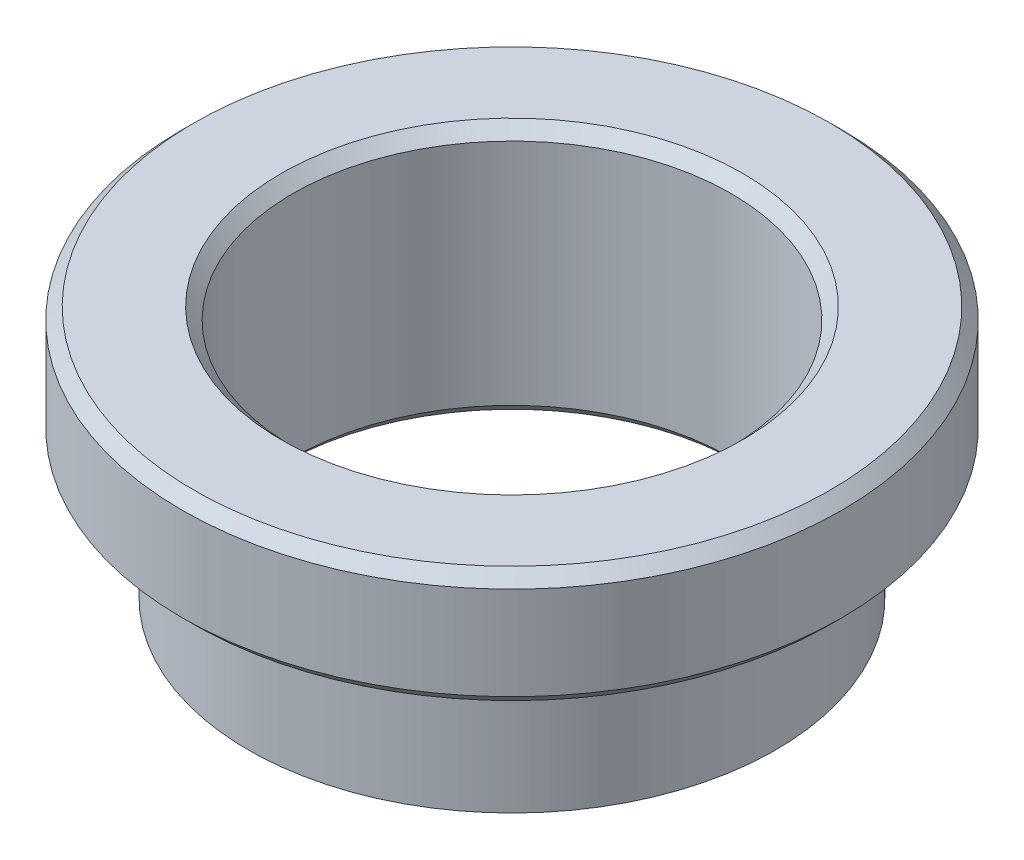
ISO-10303-21;
HEADER;
FILE_DESCRIPTION(('STEP AP214'),'2;1');
FILE_NAME('part.step','',(''),(''),'','','');
FILE_SCHEMA(('AUTOMOTIVE_DESIGN { 1 0 10303 214 1 1 1 1 }'));
ENDSEC;
DATA;
#1=APPLICATION_CONTEXT('core data for automotive mechanical design processes');
#2=APPLICATION_PROTOCOL_DEFINITION('international standard','automotive_design',2000,#1);
#3=PRODUCT_CONTEXT('',#1,'mechanical');
#4=PRODUCT('Part','Part','',(#3));
#5=PRODUCT_RELATED_PRODUCT_CATEGORY('part','',(#4));
#6=PRODUCT_DEFINITION_FORMATION('','',#4);
#7=PRODUCT_DEFINITION_CONTEXT('part definition',#1,'design');
#8=PRODUCT_DEFINITION('design','',#6,#7);
#9=PRODUCT_DEFINITION_SHAPE('','',#8);
#10=(LENGTH_UNIT() NAMED_UNIT(*) SI_UNIT(.MILLI.,.METRE.));
#11=(NAMED_UNIT(*) PLANE_ANGLE_UNIT() SI_UNIT($,.RADIAN.));
#12=(NAMED_UNIT(*) SI_UNIT($,.STERADIAN.) SOLID_ANGLE_UNIT());
#13=UNCERTAINTY_MEASURE_WITH_UNIT(LENGTH_MEASURE(1.E-05),#10,'distance_accuracy_value','');
#14=(GEOMETRIC_REPRESENTATION_CONTEXT(3) GLOBAL_UNCERTAINTY_ASSIGNED_CONTEXT((#13)) GLOBAL_UNIT_ASSIGNED_CONTEXT((#10,
#11,#12)) REPRESENTATION_CONTEXT('',''));
#15=CARTESIAN_POINT('',(0.,0.,0.));
#16=DIRECTION('',(0.,0.,1.));
#17=DIRECTION('',(1.,0.,0.));
#18=AXIS2_PLACEMENT_3D('',#15,#16,#17);
#19=CARTESIAN_POINT('',(0.,0.,0.));
#20=DIRECTION('',(0.,-1.,0.));
#21=DIRECTION('',(0.,0.,-1.));
#22=AXIS2_PLACEMENT_3D('',#19,#20,#21);
#23=CONICAL_SURFACE('',#22,5.95,0.785398163397448);
#24=CARTESIAN_POINT('',(0.,0.3,0.));
#25=DIRECTION('',(0.,-1.,0.));
#26=DIRECTION('',(0.,0.,-1.));
#27=AXIS2_PLACEMENT_3D('',#24,#25,#26);
#28=CIRCLE('',#27,5.65);
#29=CARTESIAN_POINT('',(0.,0.3,-5.65));
#30=VERTEX_POINT('',#29);
#31=EDGE_CURVE('E79',#30,#30,#28,.T.);
#32=ORIENTED_EDGE('',*,*,#31,.F.);
#33=EDGE_LOOP('',(#32));
#34=FACE_BOUND('',#33,.T.);
#35=CARTESIAN_POINT('',(0.,0.,0.));
#36=DIRECTION('',(0.,-1.,0.));
#37=DIRECTION('',(0.,0.,-1.));
#38=AXIS2_PLACEMENT_3D('',#35,#36,#37);
#39=CIRCLE('',#38,5.95);
#40=CARTESIAN_POINT('',(0.,0.,-5.95));
#41=VERTEX_POINT('',#40);
#42=EDGE_CURVE('E10',#41,#41,#39,.T.);
#43=ORIENTED_EDGE('',*,*,#42,.T.);
#44=EDGE_LOOP('',(#43));
#45=FACE_BOUND('',#44,.T.);
#46=ADVANCED_FACE('F45',(#34,#45),#23,.F.);
#47=CARTESIAN_POINT('',(0.,0.,0.));
#48=DIRECTION('',(0.,-1.,0.));
#49=DIRECTION('',(0.,0.,-1.));
#50=AXIS2_PLACEMENT_3D('',#47,#48,#49);
#51=PLANE('',#50);
#52=CARTESIAN_POINT('',(0.,0.,0.));
#53=DIRECTION('',(0.,-1.,0.));
#54=DIRECTION('',(0.,0.,-1.));
#55=AXIS2_PLACEMENT_3D('',#52,#53,#54);
#56=CIRCLE('',#55,6.8);
#57=CARTESIAN_POINT('',(0.,0.,-6.8));
#58=VERTEX_POINT('',#57);
#59=EDGE_CURVE('E51',#58,#58,#56,.T.);
#60=ORIENTED_EDGE('',*,*,#59,.T.);
#61=EDGE_LOOP('',(#60));
#62=FACE_BOUND('',#61,.T.);
#63=ORIENTED_EDGE('',*,*,#42,.F.);
#64=EDGE_LOOP('',(#63));
#65=FACE_BOUND('',#64,.T.);
#66=ADVANCED_FACE('F86',(#62,#65),#51,.T.);
#67=CARTESIAN_POINT('',(0.,0.,0.));
#68=DIRECTION('',(0.,-1.,0.));
#69=DIRECTION('',(0.,0.,-1.));
#70=AXIS2_PLACEMENT_3D('',#67,#68,#69);
#71=CYLINDRICAL_SURFACE('',#70,6.8);
#72=CARTESIAN_POINT('',(0.,3.5,0.));
#73=DIRECTION('',(0.,-1.,0.));
#74=DIRECTION('',(0.,0.,-1.));
#75=AXIS2_PLACEMENT_3D('',#72,#73,#74);
#76=CIRCLE('',#75,6.8);
#77=CARTESIAN_POINT('',(0.,3.5,-6.8));
#78=VERTEX_POINT('',#77);
#79=EDGE_CURVE('E55',#78,#78,#76,.T.);
#80=ORIENTED_EDGE('',*,*,#79,.T.);
#81=EDGE_LOOP('',(#80));
#82=FACE_BOUND('',#81,.T.);
#83=ORIENTED_EDGE('',*,*,#59,.F.);
#84=EDGE_LOOP('',(#83));
#85=FACE_BOUND('',#84,.T.);
#86=ADVANCED_FACE('F90',(#82,#85),#71,.T.);
#87=CARTESIAN_POINT('',(0.,3.5,0.));
#88=DIRECTION('',(0.,-1.,0.));
#89=DIRECTION('',(0.,0.,-1.));
#90=AXIS2_PLACEMENT_3D('',#87,#88,#89);
#91=PLANE('',#90);
#92=CARTESIAN_POINT('',(0.,3.5,0.));
#93=DIRECTION('',(0.,-1.,0.));
#94=DIRECTION('',(0.,0.,-1.));
#95=AXIS2_PLACEMENT_3D('',#92,#93,#94);
#96=CIRCLE('',#95,8.2);
#97=CARTESIAN_POINT('',(0.,3.5,-8.2));
#98=VERTEX_POINT('',#97);
#99=EDGE_CURVE('E59',#98,#98,#96,.T.);
#100=ORIENTED_EDGE('',*,*,#99,.T.);
#101=EDGE_LOOP('',(#100));
#102=FACE_BOUND('',#101,.T.);
#103=ORIENTED_EDGE('',*,*,#79,.F.);
#104=EDGE_LOOP('',(#103));
#105=FACE_BOUND('',#104,.T.);
#106=ADVANCED_FACE('F94',(#102,#105),#91,.T.);
#107=CARTESIAN_POINT('',(0.,3.5,0.));
#108=DIRECTION('',(0.,1.,0.));
#109=DIRECTION('',(0.,0.,1.));
#110=AXIS2_PLACEMENT_3D('',#107,#108,#109);
#111=CONICAL_SURFACE('',#110,8.2,0.785398163397448);
#112=CARTESIAN_POINT('',(0.,3.8,0.));
#113=DIRECTION('',(0.,-1.,0.));
#114=DIRECTION('',(0.,0.,-1.));
#115=AXIS2_PLACEMENT_3D('',#112,#113,#114);
#116=CIRCLE('',#115,8.5);
#117=CARTESIAN_POINT('',(0.,3.8,-8.5));
#118=VERTEX_POINT('',#117);
#119=EDGE_CURVE('E64',#118,#118,#116,.T.);
#120=ORIENTED_EDGE('',*,*,#119,.T.);
#121=EDGE_LOOP('',(#120));
#122=FACE_BOUND('',#121,.T.);
#123=ORIENTED_EDGE('',*,*,#99,.F.);
#124=EDGE_LOOP('',(#123));
#125=FACE_BOUND('',#124,.T.);
#126=ADVANCED_FACE('F101',(#122,#125),#111,.T.);
#127=CARTESIAN_POINT('',(0.,0.,0.));
#128=DIRECTION('',(0.,-1.,0.));
#129=DIRECTION('',(0.,0.,-1.));
#130=AXIS2_PLACEMENT_3D('',#127,#128,#129);
#131=CYLINDRICAL_SURFACE('',#130,8.5);
#132=CARTESIAN_POINT('',(0.,6.2,0.));
#133=DIRECTION('',(0.,-1.,0.));
#134=DIRECTION('',(0.,0.,-1.));
#135=AXIS2_PLACEMENT_3D('',#132,#133,#134);
#136=CIRCLE('',#135,8.5);
#137=CARTESIAN_POINT('',(0.,6.2,-8.5));
#138=VERTEX_POINT('',#137);
#139=EDGE_CURVE('E67',#138,#138,#136,.T.);
#140=ORIENTED_EDGE('',*,*,#139,.T.);
#141=EDGE_LOOP('',(#140));
#142=FACE_BOUND('',#141,.T.);
#143=ORIENTED_EDGE('',*,*,#119,.F.);
#144=EDGE_LOOP('',(#143));
#145=FACE_BOUND('',#144,.T.);
#146=ADVANCED_FACE('F105',(#142,#145),#131,.T.);
#147=CARTESIAN_POINT('',(0.,6.5,0.));
#148=DIRECTION('',(0.,-1.,0.));
#149=DIRECTION('',(0.,0.,-1.));
#150=AXIS2_PLACEMENT_3D('',#147,#148,#149);
#151=CONICAL_SURFACE('',#150,8.2,0.785398163397448);
#152=ORIENTED_EDGE('',*,*,#139,.F.);
#153=EDGE_LOOP('',(#152));
#154=FACE_BOUND('',#153,.T.);
#155=CARTESIAN_POINT('',(0.,6.5,0.));
#156=DIRECTION('',(0.,-1.,0.));
#157=DIRECTION('',(0.,0.,-1.));
#158=AXIS2_PLACEMENT_3D('',#155,#156,#157);
#159=CIRCLE('',#158,8.2);
#160=CARTESIAN_POINT('',(0.,6.5,-8.2));
#161=VERTEX_POINT('',#160);
#162=EDGE_CURVE('E70',#161,#161,#159,.T.);
#163=ORIENTED_EDGE('',*,*,#162,.T.);
#164=EDGE_LOOP('',(#163));
#165=FACE_BOUND('',#164,.T.);
#166=ADVANCED_FACE('F109',(#154,#165),#151,.T.);
#167=CARTESIAN_POINT('',(0.,6.5,0.));
#168=DIRECTION('',(0.,-1.,0.));
#169=DIRECTION('',(0.,0.,-1.));
#170=AXIS2_PLACEMENT_3D('',#167,#168,#169);
#171=PLANE('',#170);
#172=ORIENTED_EDGE('',*,*,#162,.F.);
#173=EDGE_LOOP('',(#172));
#174=FACE_BOUND('',#173,.T.);
#175=CARTESIAN_POINT('',(0.,6.5,0.));
#176=DIRECTION('',(0.,-1.,0.));
#177=DIRECTION('',(0.,0.,-1.));
#178=AXIS2_PLACEMENT_3D('',#175,#176,#177);
#179=CIRCLE('',#178,5.95);
#180=CARTESIAN_POINT('',(0.,6.5,-5.95));
#181=VERTEX_POINT('',#180);
#182=EDGE_CURVE('E73',#181,#181,#179,.T.);
#183=ORIENTED_EDGE('',*,*,#182,.T.);
#184=EDGE_LOOP('',(#183));
#185=FACE_BOUND('',#184,.T.);
#186=ADVANCED_FACE('F113',(#174,#185),#171,.F.);
#187=CARTESIAN_POINT('',(0.,6.2,0.));
#188=DIRECTION('',(0.,1.,0.));
#189=DIRECTION('',(0.,0.,1.));
#190=AXIS2_PLACEMENT_3D('',#187,#188,#189);
#191=CONICAL_SURFACE('',#190,5.65,0.785398163397448);
#192=ORIENTED_EDGE('',*,*,#182,.F.);
#193=EDGE_LOOP('',(#192));
#194=FACE_BOUND('',#193,.T.);
#195=CARTESIAN_POINT('',(0.,6.2,0.));
#196=DIRECTION('',(0.,-1.,0.));
#197=DIRECTION('',(0.,0.,-1.));
#198=AXIS2_PLACEMENT_3D('',#195,#196,#197);
#199=CIRCLE('',#198,5.65);
#200=CARTESIAN_POINT('',(0.,6.2,-5.65));
#201=VERTEX_POINT('',#200);
#202=EDGE_CURVE('E76',#201,#201,#199,.T.);
#203=ORIENTED_EDGE('',*,*,#202,.T.);
#204=EDGE_LOOP('',(#203));
#205=FACE_BOUND('',#204,.T.);
#206=ADVANCED_FACE('F117',(#194,#205),#191,.F.);
#207=CARTESIAN_POINT('',(0.,0.,0.));
#208=DIRECTION('',(0.,-1.,0.));
#209=DIRECTION('',(0.,0.,-1.));
#210=AXIS2_PLACEMENT_3D('',#207,#208,#209);
#211=CYLINDRICAL_SURFACE('',#210,5.65);
#212=ORIENTED_EDGE('',*,*,#202,.F.);
#213=EDGE_LOOP('',(#212));
#214=FACE_BOUND('',#213,.T.);
#215=ORIENTED_EDGE('',*,*,#31,.T.);
#216=EDGE_LOOP('',(#215));
#217=FACE_BOUND('',#216,.T.);
#218=ADVANCED_FACE('F83',(#214,#217),#211,.F.);
#219=CLOSED_SHELL('',(#46,#66,#86,#106,#126,#146,#166,#186,#206,#218));
#220=MANIFOLD_SOLID_BREP('B2',#219);
#221=ADVANCED_BREP_SHAPE_REPRESENTATION('',(#18,#220),#14);
#222=SHAPE_DEFINITION_REPRESENTATION(#9,#221);
ENDSEC;
END-ISO-10303-21;
